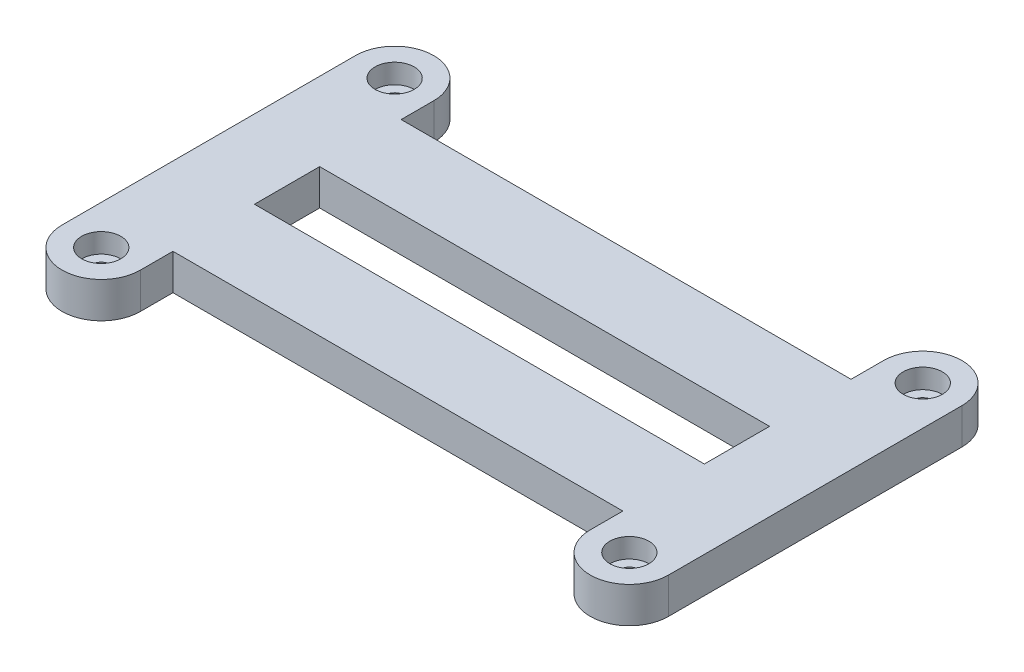
ISO-10303-21;
HEADER;
FILE_DESCRIPTION(('STEP AP214'),'2;1');
FILE_NAME('part.step','',(''),(''),'','','');
FILE_SCHEMA(('AUTOMOTIVE_DESIGN { 1 0 10303 214 1 1 1 1 }'));
ENDSEC;
DATA;
#1=APPLICATION_CONTEXT('core data for automotive mechanical design processes');
#2=APPLICATION_PROTOCOL_DEFINITION('international standard','automotive_design',2000,#1);
#3=PRODUCT_CONTEXT('',#1,'mechanical');
#4=PRODUCT('Part','Part','',(#3));
#5=PRODUCT_RELATED_PRODUCT_CATEGORY('part','',(#4));
#6=PRODUCT_DEFINITION_FORMATION('','',#4);
#7=PRODUCT_DEFINITION_CONTEXT('part definition',#1,'design');
#8=PRODUCT_DEFINITION('design','',#6,#7);
#9=PRODUCT_DEFINITION_SHAPE('','',#8);
#10=(LENGTH_UNIT() NAMED_UNIT(*) SI_UNIT(.MILLI.,.METRE.));
#11=(NAMED_UNIT(*) PLANE_ANGLE_UNIT() SI_UNIT($,.RADIAN.));
#12=(NAMED_UNIT(*) SI_UNIT($,.STERADIAN.) SOLID_ANGLE_UNIT());
#13=UNCERTAINTY_MEASURE_WITH_UNIT(LENGTH_MEASURE(1.E-05),#10,'distance_accuracy_value','');
#14=(GEOMETRIC_REPRESENTATION_CONTEXT(3) GLOBAL_UNCERTAINTY_ASSIGNED_CONTEXT((#13)) GLOBAL_UNIT_ASSIGNED_CONTEXT((#10,
#11,#12)) REPRESENTATION_CONTEXT('',''));
#15=CARTESIAN_POINT('',(0.,0.,0.));
#16=DIRECTION('',(0.,0.,1.));
#17=DIRECTION('',(1.,0.,0.));
#18=AXIS2_PLACEMENT_3D('',#15,#16,#17);
#19=CARTESIAN_POINT('',(40.5,5.5,-22.5));
#20=DIRECTION('',(0.,-1.,0.));
#21=DIRECTION('',(0.,0.,-1.));
#22=AXIS2_PLACEMENT_3D('',#19,#20,#21);
#23=CYLINDRICAL_SURFACE('',#22,1.5);
#24=CARTESIAN_POINT('',(40.5,0.,-22.5));
#25=DIRECTION('',(0.,1.,0.));
#26=DIRECTION('',(0.,0.,1.));
#27=AXIS2_PLACEMENT_3D('',#24,#25,#26);
#28=CIRCLE('',#27,1.5);
#29=CARTESIAN_POINT('',(40.5,0.,-21.));
#30=VERTEX_POINT('',#29);
#31=EDGE_CURVE('E173',#30,#30,#28,.T.);
#32=ORIENTED_EDGE('',*,*,#31,.F.);
#33=EDGE_LOOP('',(#32));
#34=FACE_BOUND('',#33,.T.);
#35=CARTESIAN_POINT('',(40.5,2.5,-22.5));
#36=DIRECTION('',(0.,1.,0.));
#37=DIRECTION('',(0.,0.,1.));
#38=AXIS2_PLACEMENT_3D('',#35,#36,#37);
#39=CIRCLE('',#38,1.5);
#40=CARTESIAN_POINT('',(40.5,2.5,-21.));
#41=VERTEX_POINT('',#40);
#42=EDGE_CURVE('E43',#41,#41,#39,.T.);
#43=ORIENTED_EDGE('',*,*,#42,.T.);
#44=EDGE_LOOP('',(#43));
#45=FACE_BOUND('',#44,.T.);
#46=ADVANCED_FACE('F39',(#34,#45),#23,.F.);
#47=CARTESIAN_POINT('',(-40.5,5.5,22.5));
#48=DIRECTION('',(0.,-1.,0.));
#49=DIRECTION('',(0.,0.,-1.));
#50=AXIS2_PLACEMENT_3D('',#47,#48,#49);
#51=CYLINDRICAL_SURFACE('',#50,1.5);
#52=CARTESIAN_POINT('',(-40.5,0.,22.5));
#53=DIRECTION('',(0.,1.,0.));
#54=DIRECTION('',(0.,0.,1.));
#55=AXIS2_PLACEMENT_3D('',#52,#53,#54);
#56=CIRCLE('',#55,1.5);
#57=CARTESIAN_POINT('',(-40.5,0.,24.));
#58=VERTEX_POINT('',#57);
#59=EDGE_CURVE('E347',#58,#58,#56,.T.);
#60=ORIENTED_EDGE('',*,*,#59,.F.);
#61=EDGE_LOOP('',(#60));
#62=FACE_BOUND('',#61,.T.);
#63=CARTESIAN_POINT('',(-40.5,2.5,22.5));
#64=DIRECTION('',(0.,1.,0.));
#65=DIRECTION('',(0.,0.,1.));
#66=AXIS2_PLACEMENT_3D('',#63,#64,#65);
#67=CIRCLE('',#66,1.5);
#68=CARTESIAN_POINT('',(-40.5,2.5,24.));
#69=VERTEX_POINT('',#68);
#70=EDGE_CURVE('E331',#69,#69,#67,.T.);
#71=ORIENTED_EDGE('',*,*,#70,.T.);
#72=EDGE_LOOP('',(#71));
#73=FACE_BOUND('',#72,.T.);
#74=ADVANCED_FACE('F381',(#62,#73),#51,.F.);
#75=CARTESIAN_POINT('',(40.5,5.5,-22.5));
#76=DIRECTION('',(0.,1.,0.));
#77=DIRECTION('',(0.,0.,1.));
#78=AXIS2_PLACEMENT_3D('',#75,#76,#77);
#79=PLANE('',#78);
#80=CARTESIAN_POINT('',(-40.5,5.5,-22.5));
#81=DIRECTION('',(0.,1.,0.));
#82=DIRECTION('',(0.,0.,-1.));
#83=AXIS2_PLACEMENT_3D('',#80,#81,#82);
#84=CIRCLE('',#83,3.);
#85=CARTESIAN_POINT('',(-40.5,5.5,-25.5));
#86=VERTEX_POINT('',#85);
#87=EDGE_CURVE('E697',#86,#86,#84,.T.);
#88=ORIENTED_EDGE('',*,*,#87,.F.);
#89=EDGE_LOOP('',(#88));
#90=FACE_BOUND('',#89,.T.);
#91=CARTESIAN_POINT('',(-40.5,5.5,22.5));
#92=DIRECTION('',(0.,1.,0.));
#93=DIRECTION('',(0.,0.,1.));
#94=AXIS2_PLACEMENT_3D('',#91,#92,#93);
#95=CIRCLE('',#94,3.);
#96=CARTESIAN_POINT('',(-40.5,5.5,25.5));
#97=VERTEX_POINT('',#96);
#98=EDGE_CURVE('E705',#97,#97,#95,.T.);
#99=ORIENTED_EDGE('',*,*,#98,.F.);
#100=EDGE_LOOP('',(#99));
#101=FACE_BOUND('',#100,.T.);
#102=CARTESIAN_POINT('',(40.5,5.5,22.5));
#103=DIRECTION('',(0.,1.,0.));
#104=DIRECTION('',(0.,0.,-1.));
#105=AXIS2_PLACEMENT_3D('',#102,#103,#104);
#106=CIRCLE('',#105,3.);
#107=CARTESIAN_POINT('',(40.5,5.5,19.5));
#108=VERTEX_POINT('',#107);
#109=EDGE_CURVE('E713',#108,#108,#106,.T.);
#110=ORIENTED_EDGE('',*,*,#109,.F.);
#111=EDGE_LOOP('',(#110));
#112=FACE_BOUND('',#111,.T.);
#113=CARTESIAN_POINT('',(40.5,5.5,-22.5));
#114=DIRECTION('',(0.,1.,0.));
#115=DIRECTION('',(0.,0.,1.));
#116=AXIS2_PLACEMENT_3D('',#113,#114,#115);
#117=CIRCLE('',#116,3.);
#118=CARTESIAN_POINT('',(40.5,5.5,-19.5));
#119=VERTEX_POINT('',#118);
#120=EDGE_CURVE('E355',#119,#119,#117,.T.);
#121=ORIENTED_EDGE('',*,*,#120,.F.);
#122=EDGE_LOOP('',(#121));
#123=FACE_BOUND('',#122,.T.);
#124=DIRECTION('',(-1.,0.,0.));
#125=VECTOR('',#124,1.);
#126=CARTESIAN_POINT('',(-34.5,5.5,-5.));
#127=LINE('',#126,#125);
#128=CARTESIAN_POINT('',(34.5,5.5,-5.));
#129=VERTEX_POINT('',#128);
#130=CARTESIAN_POINT('',(-34.5,5.5,-5.));
#131=VERTEX_POINT('',#130);
#132=EDGE_CURVE('E164',#129,#131,#127,.T.);
#133=ORIENTED_EDGE('',*,*,#132,.F.);
#134=DIRECTION('',(0.,0.,-1.));
#135=VECTOR('',#134,1.);
#136=CARTESIAN_POINT('',(34.5,5.5,-5.));
#137=LINE('',#136,#135);
#138=CARTESIAN_POINT('',(34.5,5.5,5.));
#139=VERTEX_POINT('',#138);
#140=EDGE_CURVE('E155',#139,#129,#137,.T.);
#141=ORIENTED_EDGE('',*,*,#140,.F.);
#142=DIRECTION('',(1.,0.,0.));
#143=VECTOR('',#142,1.);
#144=CARTESIAN_POINT('',(-34.5,5.5,5.));
#145=LINE('',#144,#143);
#146=CARTESIAN_POINT('',(-34.5,5.5,5.));
#147=VERTEX_POINT('',#146);
#148=EDGE_CURVE('E183',#147,#139,#145,.T.);
#149=ORIENTED_EDGE('',*,*,#148,.F.);
#150=DIRECTION('',(0.,0.,1.));
#151=VECTOR('',#150,1.);
#152=CARTESIAN_POINT('',(-34.5,5.5,-5.));
#153=LINE('',#152,#151);
#154=EDGE_CURVE('E179',#131,#147,#153,.T.);
#155=ORIENTED_EDGE('',*,*,#154,.F.);
#156=EDGE_LOOP('',(#133,#141,#149,#155));
#157=FACE_BOUND('',#156,.T.);
#158=CARTESIAN_POINT('',(40.5,5.5,-22.5));
#159=DIRECTION('',(0.,1.,0.));
#160=DIRECTION('',(0.,0.,1.));
#161=AXIS2_PLACEMENT_3D('',#158,#159,#160);
#162=CIRCLE('',#161,6.);
#163=CARTESIAN_POINT('',(46.5,5.5,-22.5));
#164=VERTEX_POINT('',#163);
#165=CARTESIAN_POINT('',(34.5,5.5,-22.5));
#166=VERTEX_POINT('',#165);
#167=EDGE_CURVE('E211',#164,#166,#162,.T.);
#168=ORIENTED_EDGE('',*,*,#167,.T.);
#169=DIRECTION('',(0.,0.,1.));
#170=VECTOR('',#169,1.);
#171=CARTESIAN_POINT('',(34.5,5.5,-22.5));
#172=LINE('',#171,#170);
#173=CARTESIAN_POINT('',(34.5,5.5,-17.5));
#174=VERTEX_POINT('',#173);
#175=EDGE_CURVE('E215',#166,#174,#172,.T.);
#176=ORIENTED_EDGE('',*,*,#175,.T.);
#177=DIRECTION('',(-1.,0.,0.));
#178=VECTOR('',#177,1.);
#179=CARTESIAN_POINT('',(-34.5,5.5,-17.5));
#180=LINE('',#179,#178);
#181=CARTESIAN_POINT('',(-34.5,5.5,-17.5));
#182=VERTEX_POINT('',#181);
#183=EDGE_CURVE('E219',#174,#182,#180,.T.);
#184=ORIENTED_EDGE('',*,*,#183,.T.);
#185=DIRECTION('',(0.,0.,-1.));
#186=VECTOR('',#185,1.);
#187=CARTESIAN_POINT('',(-34.5,5.5,-22.5));
#188=LINE('',#187,#186);
#189=CARTESIAN_POINT('',(-34.5,5.5,-22.5));
#190=VERTEX_POINT('',#189);
#191=EDGE_CURVE('E222',#182,#190,#188,.T.);
#192=ORIENTED_EDGE('',*,*,#191,.T.);
#193=CARTESIAN_POINT('',(-40.5,5.5,-22.5));
#194=DIRECTION('',(0.,1.,0.));
#195=DIRECTION('',(0.,0.,-1.));
#196=AXIS2_PLACEMENT_3D('',#193,#194,#195);
#197=CIRCLE('',#196,6.);
#198=CARTESIAN_POINT('',(-46.5,5.5,-22.5));
#199=VERTEX_POINT('',#198);
#200=EDGE_CURVE('E225',#190,#199,#197,.T.);
#201=ORIENTED_EDGE('',*,*,#200,.T.);
#202=DIRECTION('',(0.,0.,1.));
#203=VECTOR('',#202,1.);
#204=CARTESIAN_POINT('',(-46.5,5.5,-22.5));
#205=LINE('',#204,#203);
#206=CARTESIAN_POINT('',(-46.5,5.5,22.5));
#207=VERTEX_POINT('',#206);
#208=EDGE_CURVE('E228',#199,#207,#205,.T.);
#209=ORIENTED_EDGE('',*,*,#208,.T.);
#210=CARTESIAN_POINT('',(-40.5,5.5,22.5));
#211=DIRECTION('',(0.,1.,0.));
#212=DIRECTION('',(0.,0.,1.));
#213=AXIS2_PLACEMENT_3D('',#210,#211,#212);
#214=CIRCLE('',#213,6.);
#215=CARTESIAN_POINT('',(-34.5,5.5,22.5));
#216=VERTEX_POINT('',#215);
#217=EDGE_CURVE('E231',#207,#216,#214,.T.);
#218=ORIENTED_EDGE('',*,*,#217,.T.);
#219=DIRECTION('',(0.,0.,-1.));
#220=VECTOR('',#219,1.);
#221=CARTESIAN_POINT('',(-34.5,5.5,22.5));
#222=LINE('',#221,#220);
#223=CARTESIAN_POINT('',(-34.5,5.5,17.5));
#224=VERTEX_POINT('',#223);
#225=EDGE_CURVE('E234',#216,#224,#222,.T.);
#226=ORIENTED_EDGE('',*,*,#225,.T.);
#227=DIRECTION('',(1.,0.,0.));
#228=VECTOR('',#227,1.);
#229=CARTESIAN_POINT('',(-34.5,5.5,17.5));
#230=LINE('',#229,#228);
#231=CARTESIAN_POINT('',(34.5,5.5,17.5));
#232=VERTEX_POINT('',#231);
#233=EDGE_CURVE('E237',#224,#232,#230,.T.);
#234=ORIENTED_EDGE('',*,*,#233,.T.);
#235=DIRECTION('',(0.,0.,1.));
#236=VECTOR('',#235,1.);
#237=CARTESIAN_POINT('',(34.5,5.5,22.5));
#238=LINE('',#237,#236);
#239=CARTESIAN_POINT('',(34.5,5.5,22.5));
#240=VERTEX_POINT('',#239);
#241=EDGE_CURVE('E240',#232,#240,#238,.T.);
#242=ORIENTED_EDGE('',*,*,#241,.T.);
#243=CARTESIAN_POINT('',(40.5,5.5,22.5));
#244=DIRECTION('',(0.,1.,0.));
#245=DIRECTION('',(0.,0.,-1.));
#246=AXIS2_PLACEMENT_3D('',#243,#244,#245);
#247=CIRCLE('',#246,6.);
#248=CARTESIAN_POINT('',(46.5,5.5,22.5));
#249=VERTEX_POINT('',#248);
#250=EDGE_CURVE('E243',#240,#249,#247,.T.);
#251=ORIENTED_EDGE('',*,*,#250,.T.);
#252=DIRECTION('',(0.,0.,-1.));
#253=VECTOR('',#252,1.);
#254=CARTESIAN_POINT('',(46.5,5.5,-22.5));
#255=LINE('',#254,#253);
#256=EDGE_CURVE('E246',#249,#164,#255,.T.);
#257=ORIENTED_EDGE('',*,*,#256,.T.);
#258=EDGE_LOOP('',(#168,#176,#184,#192,#201,#209,#218,#226,#234,#242,#251,#257));
#259=FACE_BOUND('',#258,.T.);
#260=ADVANCED_FACE('F177',(#90,#101,#112,#123,#157,#259),#79,.T.);
#261=CARTESIAN_POINT('',(40.5,0.,-22.5));
#262=DIRECTION('',(0.,1.,0.));
#263=DIRECTION('',(0.,0.,1.));
#264=AXIS2_PLACEMENT_3D('',#261,#262,#263);
#265=PLANE('',#264);
#266=ORIENTED_EDGE('',*,*,#31,.T.);
#267=EDGE_LOOP('',(#266));
#268=FACE_BOUND('',#267,.T.);
#269=CARTESIAN_POINT('',(40.5,0.,-22.5));
#270=DIRECTION('',(0.,1.,0.));
#271=DIRECTION('',(0.,0.,1.));
#272=AXIS2_PLACEMENT_3D('',#269,#270,#271);
#273=CIRCLE('',#272,6.);
#274=CARTESIAN_POINT('',(46.5,0.,-22.5));
#275=VERTEX_POINT('',#274);
#276=CARTESIAN_POINT('',(34.5,0.,-22.5));
#277=VERTEX_POINT('',#276);
#278=EDGE_CURVE('E210',#275,#277,#273,.T.);
#279=ORIENTED_EDGE('',*,*,#278,.F.);
#280=DIRECTION('',(0.,0.,-1.));
#281=VECTOR('',#280,1.);
#282=CARTESIAN_POINT('',(46.5,0.,-22.5));
#283=LINE('',#282,#281);
#284=CARTESIAN_POINT('',(46.5,0.,22.5));
#285=VERTEX_POINT('',#284);
#286=EDGE_CURVE('E216',#285,#275,#283,.T.);
#287=ORIENTED_EDGE('',*,*,#286,.F.);
#288=CARTESIAN_POINT('',(40.5,0.,22.5));
#289=DIRECTION('',(0.,1.,0.));
#290=DIRECTION('',(0.,0.,-1.));
#291=AXIS2_PLACEMENT_3D('',#288,#289,#290);
#292=CIRCLE('',#291,6.);
#293=CARTESIAN_POINT('',(34.5,0.,22.5));
#294=VERTEX_POINT('',#293);
#295=EDGE_CURVE('E280',#294,#285,#292,.T.);
#296=ORIENTED_EDGE('',*,*,#295,.F.);
#297=DIRECTION('',(0.,0.,1.));
#298=VECTOR('',#297,1.);
#299=CARTESIAN_POINT('',(34.5,0.,22.5));
#300=LINE('',#299,#298);
#301=CARTESIAN_POINT('',(34.5,0.,17.5));
#302=VERTEX_POINT('',#301);
#303=EDGE_CURVE('E277',#302,#294,#300,.T.);
#304=ORIENTED_EDGE('',*,*,#303,.F.);
#305=DIRECTION('',(1.,0.,0.));
#306=VECTOR('',#305,1.);
#307=CARTESIAN_POINT('',(-34.5,0.,17.5));
#308=LINE('',#307,#306);
#309=CARTESIAN_POINT('',(-34.5,0.,17.5));
#310=VERTEX_POINT('',#309);
#311=EDGE_CURVE('E274',#310,#302,#308,.T.);
#312=ORIENTED_EDGE('',*,*,#311,.F.);
#313=DIRECTION('',(0.,0.,-1.));
#314=VECTOR('',#313,1.);
#315=CARTESIAN_POINT('',(-34.5,0.,22.5));
#316=LINE('',#315,#314);
#317=CARTESIAN_POINT('',(-34.5,0.,22.5));
#318=VERTEX_POINT('',#317);
#319=EDGE_CURVE('E271',#318,#310,#316,.T.);
#320=ORIENTED_EDGE('',*,*,#319,.F.);
#321=CARTESIAN_POINT('',(-40.5,0.,22.5));
#322=DIRECTION('',(0.,1.,0.));
#323=DIRECTION('',(0.,0.,1.));
#324=AXIS2_PLACEMENT_3D('',#321,#322,#323);
#325=CIRCLE('',#324,6.);
#326=CARTESIAN_POINT('',(-46.5,0.,22.5));
#327=VERTEX_POINT('',#326);
#328=EDGE_CURVE('E268',#327,#318,#325,.T.);
#329=ORIENTED_EDGE('',*,*,#328,.F.);
#330=DIRECTION('',(0.,0.,1.));
#331=VECTOR('',#330,1.);
#332=CARTESIAN_POINT('',(-46.5,0.,-22.5));
#333=LINE('',#332,#331);
#334=CARTESIAN_POINT('',(-46.5,0.,-22.5));
#335=VERTEX_POINT('',#334);
#336=EDGE_CURVE('E265',#335,#327,#333,.T.);
#337=ORIENTED_EDGE('',*,*,#336,.F.);
#338=CARTESIAN_POINT('',(-40.5,0.,-22.5));
#339=DIRECTION('',(0.,1.,0.));
#340=DIRECTION('',(0.,0.,-1.));
#341=AXIS2_PLACEMENT_3D('',#338,#339,#340);
#342=CIRCLE('',#341,6.);
#343=CARTESIAN_POINT('',(-34.5,0.,-22.5));
#344=VERTEX_POINT('',#343);
#345=EDGE_CURVE('E262',#344,#335,#342,.T.);
#346=ORIENTED_EDGE('',*,*,#345,.F.);
#347=DIRECTION('',(0.,0.,-1.));
#348=VECTOR('',#347,1.);
#349=CARTESIAN_POINT('',(-34.5,0.,-22.5));
#350=LINE('',#349,#348);
#351=CARTESIAN_POINT('',(-34.5,0.,-17.5));
#352=VERTEX_POINT('',#351);
#353=EDGE_CURVE('E259',#352,#344,#350,.T.);
#354=ORIENTED_EDGE('',*,*,#353,.F.);
#355=DIRECTION('',(-1.,0.,0.));
#356=VECTOR('',#355,1.);
#357=CARTESIAN_POINT('',(-34.5,0.,-17.5));
#358=LINE('',#357,#356);
#359=CARTESIAN_POINT('',(34.5,0.,-17.5));
#360=VERTEX_POINT('',#359);
#361=EDGE_CURVE('E256',#360,#352,#358,.T.);
#362=ORIENTED_EDGE('',*,*,#361,.F.);
#363=DIRECTION('',(0.,0.,1.));
#364=VECTOR('',#363,1.);
#365=CARTESIAN_POINT('',(34.5,0.,-22.5));
#366=LINE('',#365,#364);
#367=EDGE_CURVE('E253',#277,#360,#366,.T.);
#368=ORIENTED_EDGE('',*,*,#367,.F.);
#369=EDGE_LOOP('',(#279,#287,#296,#304,#312,#320,#329,#337,#346,#354,#362,#368));
#370=FACE_BOUND('',#369,.T.);
#371=DIRECTION('',(0.,0.,-1.));
#372=VECTOR('',#371,1.);
#373=CARTESIAN_POINT('',(34.5,0.,-5.));
#374=LINE('',#373,#372);
#375=CARTESIAN_POINT('',(34.5,0.,5.));
#376=VERTEX_POINT('',#375);
#377=CARTESIAN_POINT('',(34.5,0.,-5.));
#378=VERTEX_POINT('',#377);
#379=EDGE_CURVE('E65',#376,#378,#374,.T.);
#380=ORIENTED_EDGE('',*,*,#379,.T.);
#381=DIRECTION('',(-1.,0.,0.));
#382=VECTOR('',#381,1.);
#383=CARTESIAN_POINT('',(-34.5,0.,-5.));
#384=LINE('',#383,#382);
#385=CARTESIAN_POINT('',(-34.5,0.,-5.));
#386=VERTEX_POINT('',#385);
#387=EDGE_CURVE('E171',#378,#386,#384,.T.);
#388=ORIENTED_EDGE('',*,*,#387,.T.);
#389=DIRECTION('',(0.,0.,1.));
#390=VECTOR('',#389,1.);
#391=CARTESIAN_POINT('',(-34.5,0.,-5.));
#392=LINE('',#391,#390);
#393=CARTESIAN_POINT('',(-34.5,0.,5.));
#394=VERTEX_POINT('',#393);
#395=EDGE_CURVE('E194',#386,#394,#392,.T.);
#396=ORIENTED_EDGE('',*,*,#395,.T.);
#397=DIRECTION('',(1.,0.,0.));
#398=VECTOR('',#397,1.);
#399=CARTESIAN_POINT('',(-34.5,0.,5.));
#400=LINE('',#399,#398);
#401=EDGE_CURVE('E165',#394,#376,#400,.T.);
#402=ORIENTED_EDGE('',*,*,#401,.T.);
#403=EDGE_LOOP('',(#380,#388,#396,#402));
#404=FACE_BOUND('',#403,.T.);
#405=CARTESIAN_POINT('',(40.5,0.,22.5));
#406=DIRECTION('',(0.,1.,0.));
#407=DIRECTION('',(0.,0.,-1.));
#408=AXIS2_PLACEMENT_3D('',#405,#406,#407);
#409=CIRCLE('',#408,1.5);
#410=CARTESIAN_POINT('',(40.5,0.,21.));
#411=VERTEX_POINT('',#410);
#412=EDGE_CURVE('E191',#411,#411,#409,.T.);
#413=ORIENTED_EDGE('',*,*,#412,.T.);
#414=EDGE_LOOP('',(#413));
#415=FACE_BOUND('',#414,.T.);
#416=ORIENTED_EDGE('',*,*,#59,.T.);
#417=EDGE_LOOP('',(#416));
#418=FACE_BOUND('',#417,.T.);
#419=CARTESIAN_POINT('',(-40.5,0.,-22.5));
#420=DIRECTION('',(0.,1.,0.));
#421=DIRECTION('',(0.,0.,-1.));
#422=AXIS2_PLACEMENT_3D('',#419,#420,#421);
#423=CIRCLE('',#422,1.5);
#424=CARTESIAN_POINT('',(-40.5,0.,-24.));
#425=VERTEX_POINT('',#424);
#426=EDGE_CURVE('E342',#425,#425,#423,.T.);
#427=ORIENTED_EDGE('',*,*,#426,.T.);
#428=EDGE_LOOP('',(#427));
#429=FACE_BOUND('',#428,.T.);
#430=ADVANCED_FACE('F361',(#268,#370,#404,#415,#418,#429),#265,.F.);
#431=CARTESIAN_POINT('',(40.5,5.5,-22.5));
#432=DIRECTION('',(0.,-1.,0.));
#433=DIRECTION('',(0.,0.,-1.));
#434=AXIS2_PLACEMENT_3D('',#431,#432,#433);
#435=CYLINDRICAL_SURFACE('',#434,6.);
#436=ORIENTED_EDGE('',*,*,#278,.T.);
#437=DIRECTION('',(0.,-1.,0.));
#438=VECTOR('',#437,1.);
#439=CARTESIAN_POINT('',(34.5,5.5,-22.5));
#440=LINE('',#439,#438);
#441=EDGE_CURVE('E11',#166,#277,#440,.T.);
#442=ORIENTED_EDGE('',*,*,#441,.F.);
#443=ORIENTED_EDGE('',*,*,#167,.F.);
#444=DIRECTION('',(0.,-1.,0.));
#445=VECTOR('',#444,1.);
#446=CARTESIAN_POINT('',(46.5,5.5,-22.5));
#447=LINE('',#446,#445);
#448=EDGE_CURVE('E249',#164,#275,#447,.T.);
#449=ORIENTED_EDGE('',*,*,#448,.T.);
#450=EDGE_LOOP('',(#436,#442,#443,#449));
#451=FACE_BOUND('',#450,.T.);
#452=ADVANCED_FACE('F41',(#451),#435,.T.);
#453=CARTESIAN_POINT('',(34.5,5.5,-22.5));
#454=DIRECTION('',(1.,0.,0.));
#455=DIRECTION('',(0.,0.,-1.));
#456=AXIS2_PLACEMENT_3D('',#453,#454,#455);
#457=PLANE('',#456);
#458=ORIENTED_EDGE('',*,*,#367,.T.);
#459=DIRECTION('',(0.,-1.,0.));
#460=VECTOR('',#459,1.);
#461=CARTESIAN_POINT('',(34.5,5.5,-17.5));
#462=LINE('',#461,#460);
#463=EDGE_CURVE('E49',#174,#360,#462,.T.);
#464=ORIENTED_EDGE('',*,*,#463,.F.);
#465=ORIENTED_EDGE('',*,*,#175,.F.);
#466=ORIENTED_EDGE('',*,*,#441,.T.);
#467=EDGE_LOOP('',(#458,#464,#465,#466));
#468=FACE_BOUND('',#467,.T.);
#469=ADVANCED_FACE('F436',(#468),#457,.F.);
#470=CARTESIAN_POINT('',(-34.5,5.5,-17.5));
#471=DIRECTION('',(0.,0.,1.));
#472=DIRECTION('',(1.,0.,0.));
#473=AXIS2_PLACEMENT_3D('',#470,#471,#472);
#474=PLANE('',#473);
#475=ORIENTED_EDGE('',*,*,#361,.T.);
#476=DIRECTION('',(0.,-1.,0.));
#477=VECTOR('',#476,1.);
#478=CARTESIAN_POINT('',(-34.5,5.5,-17.5));
#479=LINE('',#478,#477);
#480=EDGE_CURVE('E320',#182,#352,#479,.T.);
#481=ORIENTED_EDGE('',*,*,#480,.F.);
#482=ORIENTED_EDGE('',*,*,#183,.F.);
#483=ORIENTED_EDGE('',*,*,#463,.T.);
#484=EDGE_LOOP('',(#475,#481,#482,#483));
#485=FACE_BOUND('',#484,.T.);
#486=ADVANCED_FACE('F433',(#485),#474,.F.);
#487=CARTESIAN_POINT('',(-34.5,5.5,-22.5));
#488=DIRECTION('',(-1.,0.,0.));
#489=DIRECTION('',(0.,0.,1.));
#490=AXIS2_PLACEMENT_3D('',#487,#488,#489);
#491=PLANE('',#490);
#492=ORIENTED_EDGE('',*,*,#353,.T.);
#493=DIRECTION('',(0.,-1.,0.));
#494=VECTOR('',#493,1.);
#495=CARTESIAN_POINT('',(-34.5,5.5,-22.5));
#496=LINE('',#495,#494);
#497=EDGE_CURVE('E316',#190,#344,#496,.T.);
#498=ORIENTED_EDGE('',*,*,#497,.F.);
#499=ORIENTED_EDGE('',*,*,#191,.F.);
#500=ORIENTED_EDGE('',*,*,#480,.T.);
#501=EDGE_LOOP('',(#492,#498,#499,#500));
#502=FACE_BOUND('',#501,.T.);
#503=ADVANCED_FACE('F429',(#502),#491,.F.);
#504=CARTESIAN_POINT('',(-40.5,5.5,-22.5));
#505=DIRECTION('',(0.,-1.,0.));
#506=DIRECTION('',(0.,0.,-1.));
#507=AXIS2_PLACEMENT_3D('',#504,#505,#506);
#508=CYLINDRICAL_SURFACE('',#507,6.);
#509=ORIENTED_EDGE('',*,*,#345,.T.);
#510=DIRECTION('',(0.,-1.,0.));
#511=VECTOR('',#510,1.);
#512=CARTESIAN_POINT('',(-46.5,5.5,-22.5));
#513=LINE('',#512,#511);
#514=EDGE_CURVE('E312',#199,#335,#513,.T.);
#515=ORIENTED_EDGE('',*,*,#514,.F.);
#516=ORIENTED_EDGE('',*,*,#200,.F.);
#517=ORIENTED_EDGE('',*,*,#497,.T.);
#518=EDGE_LOOP('',(#509,#515,#516,#517));
#519=FACE_BOUND('',#518,.T.);
#520=ADVANCED_FACE('F425',(#519),#508,.T.);
#521=CARTESIAN_POINT('',(-46.5,5.5,-22.5));
#522=DIRECTION('',(1.,0.,0.));
#523=DIRECTION('',(0.,0.,-1.));
#524=AXIS2_PLACEMENT_3D('',#521,#522,#523);
#525=PLANE('',#524);
#526=ORIENTED_EDGE('',*,*,#336,.T.);
#527=DIRECTION('',(0.,-1.,0.));
#528=VECTOR('',#527,1.);
#529=CARTESIAN_POINT('',(-46.5,5.5,22.5));
#530=LINE('',#529,#528);
#531=EDGE_CURVE('E308',#207,#327,#530,.T.);
#532=ORIENTED_EDGE('',*,*,#531,.F.);
#533=ORIENTED_EDGE('',*,*,#208,.F.);
#534=ORIENTED_EDGE('',*,*,#514,.T.);
#535=EDGE_LOOP('',(#526,#532,#533,#534));
#536=FACE_BOUND('',#535,.T.);
#537=ADVANCED_FACE('F421',(#536),#525,.F.);
#538=CARTESIAN_POINT('',(-40.5,5.5,22.5));
#539=DIRECTION('',(0.,-1.,0.));
#540=DIRECTION('',(0.,0.,-1.));
#541=AXIS2_PLACEMENT_3D('',#538,#539,#540);
#542=CYLINDRICAL_SURFACE('',#541,6.);
#543=ORIENTED_EDGE('',*,*,#328,.T.);
#544=DIRECTION('',(0.,-1.,0.));
#545=VECTOR('',#544,1.);
#546=CARTESIAN_POINT('',(-34.5,5.5,22.5));
#547=LINE('',#546,#545);
#548=EDGE_CURVE('E304',#216,#318,#547,.T.);
#549=ORIENTED_EDGE('',*,*,#548,.F.);
#550=ORIENTED_EDGE('',*,*,#217,.F.);
#551=ORIENTED_EDGE('',*,*,#531,.T.);
#552=EDGE_LOOP('',(#543,#549,#550,#551));
#553=FACE_BOUND('',#552,.T.);
#554=ADVANCED_FACE('F417',(#553),#542,.T.);
#555=CARTESIAN_POINT('',(-34.5,5.5,22.5));
#556=DIRECTION('',(-1.,0.,0.));
#557=DIRECTION('',(0.,0.,1.));
#558=AXIS2_PLACEMENT_3D('',#555,#556,#557);
#559=PLANE('',#558);
#560=ORIENTED_EDGE('',*,*,#319,.T.);
#561=DIRECTION('',(0.,-1.,0.));
#562=VECTOR('',#561,1.);
#563=CARTESIAN_POINT('',(-34.5,5.5,17.5));
#564=LINE('',#563,#562);
#565=EDGE_CURVE('E300',#224,#310,#564,.T.);
#566=ORIENTED_EDGE('',*,*,#565,.F.);
#567=ORIENTED_EDGE('',*,*,#225,.F.);
#568=ORIENTED_EDGE('',*,*,#548,.T.);
#569=EDGE_LOOP('',(#560,#566,#567,#568));
#570=FACE_BOUND('',#569,.T.);
#571=ADVANCED_FACE('F413',(#570),#559,.F.);
#572=CARTESIAN_POINT('',(-34.5,5.5,17.5));
#573=DIRECTION('',(0.,0.,-1.));
#574=DIRECTION('',(-1.,0.,0.));
#575=AXIS2_PLACEMENT_3D('',#572,#573,#574);
#576=PLANE('',#575);
#577=ORIENTED_EDGE('',*,*,#311,.T.);
#578=DIRECTION('',(0.,-1.,0.));
#579=VECTOR('',#578,1.);
#580=CARTESIAN_POINT('',(34.5,5.5,17.5));
#581=LINE('',#580,#579);
#582=EDGE_CURVE('E296',#232,#302,#581,.T.);
#583=ORIENTED_EDGE('',*,*,#582,.F.);
#584=ORIENTED_EDGE('',*,*,#233,.F.);
#585=ORIENTED_EDGE('',*,*,#565,.T.);
#586=EDGE_LOOP('',(#577,#583,#584,#585));
#587=FACE_BOUND('',#586,.T.);
#588=ADVANCED_FACE('F409',(#587),#576,.F.);
#589=CARTESIAN_POINT('',(34.5,5.5,22.5));
#590=DIRECTION('',(1.,0.,0.));
#591=DIRECTION('',(0.,0.,-1.));
#592=AXIS2_PLACEMENT_3D('',#589,#590,#591);
#593=PLANE('',#592);
#594=ORIENTED_EDGE('',*,*,#303,.T.);
#595=DIRECTION('',(0.,-1.,0.));
#596=VECTOR('',#595,1.);
#597=CARTESIAN_POINT('',(34.5,5.5,22.5));
#598=LINE('',#597,#596);
#599=EDGE_CURVE('E292',#240,#294,#598,.T.);
#600=ORIENTED_EDGE('',*,*,#599,.F.);
#601=ORIENTED_EDGE('',*,*,#241,.F.);
#602=ORIENTED_EDGE('',*,*,#582,.T.);
#603=EDGE_LOOP('',(#594,#600,#601,#602));
#604=FACE_BOUND('',#603,.T.);
#605=ADVANCED_FACE('F405',(#604),#593,.F.);
#606=CARTESIAN_POINT('',(40.5,5.5,22.5));
#607=DIRECTION('',(0.,-1.,0.));
#608=DIRECTION('',(0.,0.,-1.));
#609=AXIS2_PLACEMENT_3D('',#606,#607,#608);
#610=CYLINDRICAL_SURFACE('',#609,6.);
#611=ORIENTED_EDGE('',*,*,#295,.T.);
#612=DIRECTION('',(0.,-1.,0.));
#613=VECTOR('',#612,1.);
#614=CARTESIAN_POINT('',(46.5,5.5,22.5));
#615=LINE('',#614,#613);
#616=EDGE_CURVE('E288',#249,#285,#615,.T.);
#617=ORIENTED_EDGE('',*,*,#616,.F.);
#618=ORIENTED_EDGE('',*,*,#250,.F.);
#619=ORIENTED_EDGE('',*,*,#599,.T.);
#620=EDGE_LOOP('',(#611,#617,#618,#619));
#621=FACE_BOUND('',#620,.T.);
#622=ADVANCED_FACE('F401',(#621),#610,.T.);
#623=CARTESIAN_POINT('',(46.5,5.5,-22.5));
#624=DIRECTION('',(-1.,0.,0.));
#625=DIRECTION('',(0.,0.,1.));
#626=AXIS2_PLACEMENT_3D('',#623,#624,#625);
#627=PLANE('',#626);
#628=ORIENTED_EDGE('',*,*,#286,.T.);
#629=ORIENTED_EDGE('',*,*,#448,.F.);
#630=ORIENTED_EDGE('',*,*,#256,.F.);
#631=ORIENTED_EDGE('',*,*,#616,.T.);
#632=EDGE_LOOP('',(#628,#629,#630,#631));
#633=FACE_BOUND('',#632,.T.);
#634=ADVANCED_FACE('F398',(#633),#627,.F.);
#635=CARTESIAN_POINT('',(34.5,5.5,-5.));
#636=DIRECTION('',(-1.,0.,0.));
#637=DIRECTION('',(0.,0.,1.));
#638=AXIS2_PLACEMENT_3D('',#635,#636,#637);
#639=PLANE('',#638);
#640=ORIENTED_EDGE('',*,*,#379,.F.);
#641=DIRECTION('',(0.,-1.,0.));
#642=VECTOR('',#641,1.);
#643=CARTESIAN_POINT('',(34.5,5.5,5.));
#644=LINE('',#643,#642);
#645=EDGE_CURVE('E159',#139,#376,#644,.T.);
#646=ORIENTED_EDGE('',*,*,#645,.F.);
#647=ORIENTED_EDGE('',*,*,#140,.T.);
#648=DIRECTION('',(0.,-1.,0.));
#649=VECTOR('',#648,1.);
#650=CARTESIAN_POINT('',(34.5,5.5,-5.));
#651=LINE('',#650,#649);
#652=EDGE_CURVE('E158',#129,#378,#651,.T.);
#653=ORIENTED_EDGE('',*,*,#652,.T.);
#654=EDGE_LOOP('',(#640,#646,#647,#653));
#655=FACE_BOUND('',#654,.T.);
#656=ADVANCED_FACE('F157',(#655),#639,.T.);
#657=CARTESIAN_POINT('',(-34.5,5.5,-5.));
#658=DIRECTION('',(0.,0.,1.));
#659=DIRECTION('',(1.,0.,0.));
#660=AXIS2_PLACEMENT_3D('',#657,#658,#659);
#661=PLANE('',#660);
#662=ORIENTED_EDGE('',*,*,#387,.F.);
#663=ORIENTED_EDGE('',*,*,#652,.F.);
#664=ORIENTED_EDGE('',*,*,#132,.T.);
#665=DIRECTION('',(0.,-1.,0.));
#666=VECTOR('',#665,1.);
#667=CARTESIAN_POINT('',(-34.5,5.5,-5.));
#668=LINE('',#667,#666);
#669=EDGE_CURVE('E174',#131,#386,#668,.T.);
#670=ORIENTED_EDGE('',*,*,#669,.T.);
#671=EDGE_LOOP('',(#662,#663,#664,#670));
#672=FACE_BOUND('',#671,.T.);
#673=ADVANCED_FACE('F168',(#672),#661,.T.);
#674=CARTESIAN_POINT('',(-34.5,5.5,-5.));
#675=DIRECTION('',(1.,0.,0.));
#676=DIRECTION('',(0.,0.,-1.));
#677=AXIS2_PLACEMENT_3D('',#674,#675,#676);
#678=PLANE('',#677);
#679=ORIENTED_EDGE('',*,*,#395,.F.);
#680=ORIENTED_EDGE('',*,*,#669,.F.);
#681=ORIENTED_EDGE('',*,*,#154,.T.);
#682=DIRECTION('',(0.,-1.,0.));
#683=VECTOR('',#682,1.);
#684=CARTESIAN_POINT('',(-34.5,5.5,5.));
#685=LINE('',#684,#683);
#686=EDGE_CURVE('E57',#147,#394,#685,.T.);
#687=ORIENTED_EDGE('',*,*,#686,.T.);
#688=EDGE_LOOP('',(#679,#680,#681,#687));
#689=FACE_BOUND('',#688,.T.);
#690=ADVANCED_FACE('F377',(#689),#678,.T.);
#691=CARTESIAN_POINT('',(-34.5,5.5,5.));
#692=DIRECTION('',(0.,0.,-1.));
#693=DIRECTION('',(-1.,0.,0.));
#694=AXIS2_PLACEMENT_3D('',#691,#692,#693);
#695=PLANE('',#694);
#696=ORIENTED_EDGE('',*,*,#401,.F.);
#697=ORIENTED_EDGE('',*,*,#686,.F.);
#698=ORIENTED_EDGE('',*,*,#148,.T.);
#699=ORIENTED_EDGE('',*,*,#645,.T.);
#700=EDGE_LOOP('',(#696,#697,#698,#699));
#701=FACE_BOUND('',#700,.T.);
#702=ADVANCED_FACE('F367',(#701),#695,.T.);
#703=CARTESIAN_POINT('',(40.5,5.5,22.5));
#704=DIRECTION('',(0.,-1.,0.));
#705=DIRECTION('',(0.,0.,-1.));
#706=AXIS2_PLACEMENT_3D('',#703,#704,#705);
#707=CYLINDRICAL_SURFACE('',#706,1.5);
#708=CARTESIAN_POINT('',(40.5,2.5,22.5));
#709=DIRECTION('',(0.,-1.,0.));
#710=DIRECTION('',(0.,0.,-1.));
#711=AXIS2_PLACEMENT_3D('',#708,#709,#710);
#712=CIRCLE('',#711,1.5);
#713=CARTESIAN_POINT('',(40.5,2.5,21.));
#714=VERTEX_POINT('',#713);
#715=EDGE_CURVE('E335',#714,#714,#712,.T.);
#716=ORIENTED_EDGE('',*,*,#715,.F.);
#717=EDGE_LOOP('',(#716));
#718=FACE_BOUND('',#717,.T.);
#719=ORIENTED_EDGE('',*,*,#412,.F.);
#720=EDGE_LOOP('',(#719));
#721=FACE_BOUND('',#720,.T.);
#722=ADVANCED_FACE('F364',(#718,#721),#707,.F.);
#723=CARTESIAN_POINT('',(-40.5,5.5,-22.5));
#724=DIRECTION('',(0.,-1.,0.));
#725=DIRECTION('',(0.,0.,-1.));
#726=AXIS2_PLACEMENT_3D('',#723,#724,#725);
#727=CYLINDRICAL_SURFACE('',#726,1.5);
#728=CARTESIAN_POINT('',(-40.5,2.5,-22.5));
#729=DIRECTION('',(0.,-1.,0.));
#730=DIRECTION('',(0.,0.,-1.));
#731=AXIS2_PLACEMENT_3D('',#728,#729,#730);
#732=CIRCLE('',#731,1.5);
#733=CARTESIAN_POINT('',(-40.5,2.5,-24.));
#734=VERTEX_POINT('',#733);
#735=EDGE_CURVE('E327',#734,#734,#732,.T.);
#736=ORIENTED_EDGE('',*,*,#735,.F.);
#737=EDGE_LOOP('',(#736));
#738=FACE_BOUND('',#737,.T.);
#739=ORIENTED_EDGE('',*,*,#426,.F.);
#740=EDGE_LOOP('',(#739));
#741=FACE_BOUND('',#740,.T.);
#742=ADVANCED_FACE('F366',(#738,#741),#727,.F.);
#743=CARTESIAN_POINT('',(-40.5,2.5,-22.5));
#744=DIRECTION('',(0.,1.,0.));
#745=DIRECTION('',(0.,0.,1.));
#746=AXIS2_PLACEMENT_3D('',#743,#744,#745);
#747=CYLINDRICAL_SURFACE('',#746,3.);
#748=CARTESIAN_POINT('',(-40.5,2.5,-22.5));
#749=DIRECTION('',(0.,1.,0.));
#750=DIRECTION('',(0.,0.,-1.));
#751=AXIS2_PLACEMENT_3D('',#748,#749,#750);
#752=CIRCLE('',#751,3.);
#753=CARTESIAN_POINT('',(-40.5,2.5,-25.5));
#754=VERTEX_POINT('',#753);
#755=EDGE_CURVE('E701',#754,#754,#752,.T.);
#756=ORIENTED_EDGE('',*,*,#755,.F.);
#757=EDGE_LOOP('',(#756));
#758=FACE_BOUND('',#757,.T.);
#759=ORIENTED_EDGE('',*,*,#87,.T.);
#760=EDGE_LOOP('',(#759));
#761=FACE_BOUND('',#760,.T.);
#762=ADVANCED_FACE('F374',(#758,#761),#747,.F.);
#763=CARTESIAN_POINT('',(-40.5,2.5,-22.5));
#764=DIRECTION('',(0.,-1.,0.));
#765=DIRECTION('',(0.,0.,-1.));
#766=AXIS2_PLACEMENT_3D('',#763,#764,#765);
#767=PLANE('',#766);
#768=ORIENTED_EDGE('',*,*,#735,.T.);
#769=EDGE_LOOP('',(#768));
#770=FACE_BOUND('',#769,.T.);
#771=ORIENTED_EDGE('',*,*,#755,.T.);
#772=EDGE_LOOP('',(#771));
#773=FACE_BOUND('',#772,.T.);
#774=ADVANCED_FACE('F616',(#770,#773),#767,.F.);
#775=CARTESIAN_POINT('',(-40.5,2.5,22.5));
#776=DIRECTION('',(0.,1.,0.));
#777=DIRECTION('',(0.,0.,1.));
#778=AXIS2_PLACEMENT_3D('',#775,#776,#777);
#779=CYLINDRICAL_SURFACE('',#778,3.);
#780=CARTESIAN_POINT('',(-40.5,2.5,22.5));
#781=DIRECTION('',(0.,1.,0.));
#782=DIRECTION('',(0.,0.,1.));
#783=AXIS2_PLACEMENT_3D('',#780,#781,#782);
#784=CIRCLE('',#783,3.);
#785=CARTESIAN_POINT('',(-40.5,2.5,25.5));
#786=VERTEX_POINT('',#785);
#787=EDGE_CURVE('E709',#786,#786,#784,.T.);
#788=ORIENTED_EDGE('',*,*,#787,.F.);
#789=EDGE_LOOP('',(#788));
#790=FACE_BOUND('',#789,.T.);
#791=ORIENTED_EDGE('',*,*,#98,.T.);
#792=EDGE_LOOP('',(#791));
#793=FACE_BOUND('',#792,.T.);
#794=ADVANCED_FACE('F626',(#790,#793),#779,.F.);
#795=CARTESIAN_POINT('',(-40.5,2.5,22.5));
#796=DIRECTION('',(0.,1.,0.));
#797=DIRECTION('',(0.,0.,1.));
#798=AXIS2_PLACEMENT_3D('',#795,#796,#797);
#799=PLANE('',#798);
#800=ORIENTED_EDGE('',*,*,#70,.F.);
#801=EDGE_LOOP('',(#800));
#802=FACE_BOUND('',#801,.T.);
#803=ORIENTED_EDGE('',*,*,#787,.T.);
#804=EDGE_LOOP('',(#803));
#805=FACE_BOUND('',#804,.T.);
#806=ADVANCED_FACE('F636',(#802,#805),#799,.T.);
#807=CARTESIAN_POINT('',(40.5,2.5,22.5));
#808=DIRECTION('',(0.,1.,0.));
#809=DIRECTION('',(0.,0.,1.));
#810=AXIS2_PLACEMENT_3D('',#807,#808,#809);
#811=CYLINDRICAL_SURFACE('',#810,3.);
#812=CARTESIAN_POINT('',(40.5,2.5,22.5));
#813=DIRECTION('',(0.,1.,0.));
#814=DIRECTION('',(0.,0.,-1.));
#815=AXIS2_PLACEMENT_3D('',#812,#813,#814);
#816=CIRCLE('',#815,3.);
#817=CARTESIAN_POINT('',(40.5,2.5,19.5));
#818=VERTEX_POINT('',#817);
#819=EDGE_CURVE('E695',#818,#818,#816,.T.);
#820=ORIENTED_EDGE('',*,*,#819,.F.);
#821=EDGE_LOOP('',(#820));
#822=FACE_BOUND('',#821,.T.);
#823=ORIENTED_EDGE('',*,*,#109,.T.);
#824=EDGE_LOOP('',(#823));
#825=FACE_BOUND('',#824,.T.);
#826=ADVANCED_FACE('F646',(#822,#825),#811,.F.);
#827=CARTESIAN_POINT('',(40.5,2.5,22.5));
#828=DIRECTION('',(0.,-1.,0.));
#829=DIRECTION('',(0.,0.,-1.));
#830=AXIS2_PLACEMENT_3D('',#827,#828,#829);
#831=PLANE('',#830);
#832=ORIENTED_EDGE('',*,*,#715,.T.);
#833=EDGE_LOOP('',(#832));
#834=FACE_BOUND('',#833,.T.);
#835=ORIENTED_EDGE('',*,*,#819,.T.);
#836=EDGE_LOOP('',(#835));
#837=FACE_BOUND('',#836,.T.);
#838=ADVANCED_FACE('F656',(#834,#837),#831,.F.);
#839=CARTESIAN_POINT('',(40.5,2.5,-22.5));
#840=DIRECTION('',(0.,1.,0.));
#841=DIRECTION('',(0.,0.,1.));
#842=AXIS2_PLACEMENT_3D('',#839,#840,#841);
#843=CYLINDRICAL_SURFACE('',#842,3.);
#844=CARTESIAN_POINT('',(40.5,2.5,-22.5));
#845=DIRECTION('',(0.,1.,0.));
#846=DIRECTION('',(0.,0.,1.));
#847=AXIS2_PLACEMENT_3D('',#844,#845,#846);
#848=CIRCLE('',#847,3.);
#849=CARTESIAN_POINT('',(40.5,2.5,-19.5));
#850=VERTEX_POINT('',#849);
#851=EDGE_CURVE('E332',#850,#850,#848,.T.);
#852=ORIENTED_EDGE('',*,*,#851,.F.);
#853=EDGE_LOOP('',(#852));
#854=FACE_BOUND('',#853,.T.);
#855=ORIENTED_EDGE('',*,*,#120,.T.);
#856=EDGE_LOOP('',(#855));
#857=FACE_BOUND('',#856,.T.);
#858=ADVANCED_FACE('F666',(#854,#857),#843,.F.);
#859=CARTESIAN_POINT('',(40.5,2.5,-22.5));
#860=DIRECTION('',(0.,1.,0.));
#861=DIRECTION('',(0.,0.,1.));
#862=AXIS2_PLACEMENT_3D('',#859,#860,#861);
#863=PLANE('',#862);
#864=ORIENTED_EDGE('',*,*,#42,.F.);
#865=EDGE_LOOP('',(#864));
#866=FACE_BOUND('',#865,.T.);
#867=ORIENTED_EDGE('',*,*,#851,.T.);
#868=EDGE_LOOP('',(#867));
#869=FACE_BOUND('',#868,.T.);
#870=ADVANCED_FACE('F675',(#866,#869),#863,.T.);
#871=CLOSED_SHELL('',(#46,#74,#260,#430,#452,#469,#486,#503,#520,#537,#554,#571,#588,#605,#622,
#634,#656,#673,#690,#702,#722,#742,#762,#774,#794,#806,#826,#838,#858,#870));
#872=MANIFOLD_SOLID_BREP('B2',#871);
#873=ADVANCED_BREP_SHAPE_REPRESENTATION('',(#18,#872),#14);
#874=SHAPE_DEFINITION_REPRESENTATION(#9,#873);
ENDSEC;
END-ISO-10303-21;
